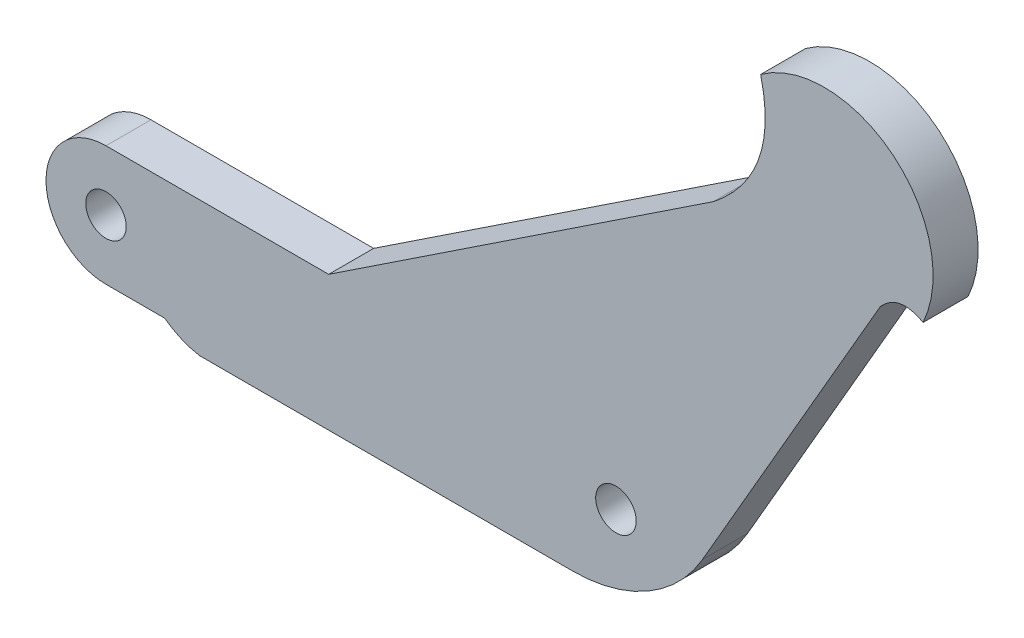
ISO-10303-21;
HEADER;
FILE_DESCRIPTION(('STEP AP214'),'2;1');
FILE_NAME('part.step','',(''),(''),'','','');
FILE_SCHEMA(('AUTOMOTIVE_DESIGN { 1 0 10303 214 1 1 1 1 }'));
ENDSEC;
DATA;
#1=APPLICATION_CONTEXT('core data for automotive mechanical design processes');
#2=APPLICATION_PROTOCOL_DEFINITION('international standard','automotive_design',2000,#1);
#3=PRODUCT_CONTEXT('',#1,'mechanical');
#4=PRODUCT('Part','Part','',(#3));
#5=PRODUCT_RELATED_PRODUCT_CATEGORY('part','',(#4));
#6=PRODUCT_DEFINITION_FORMATION('','',#4);
#7=PRODUCT_DEFINITION_CONTEXT('part definition',#1,'design');
#8=PRODUCT_DEFINITION('design','',#6,#7);
#9=PRODUCT_DEFINITION_SHAPE('','',#8);
#10=(LENGTH_UNIT() NAMED_UNIT(*) SI_UNIT(.MILLI.,.METRE.));
#11=(NAMED_UNIT(*) PLANE_ANGLE_UNIT() SI_UNIT($,.RADIAN.));
#12=(NAMED_UNIT(*) SI_UNIT($,.STERADIAN.) SOLID_ANGLE_UNIT());
#13=UNCERTAINTY_MEASURE_WITH_UNIT(LENGTH_MEASURE(1.E-05),#10,'distance_accuracy_value','');
#14=(GEOMETRIC_REPRESENTATION_CONTEXT(3) GLOBAL_UNCERTAINTY_ASSIGNED_CONTEXT((#13)) GLOBAL_UNIT_ASSIGNED_CONTEXT((#10,
#11,#12)) REPRESENTATION_CONTEXT('',''));
#15=CARTESIAN_POINT('',(0.,0.,0.));
#16=DIRECTION('',(0.,0.,1.));
#17=DIRECTION('',(1.,0.,0.));
#18=AXIS2_PLACEMENT_3D('',#15,#16,#17);
#19=CARTESIAN_POINT('',(5.00791760518448,-4.63372021491549,3.));
#20=DIRECTION('',(0.,0.,-1.));
#21=DIRECTION('',(-1.,0.,0.));
#22=AXIS2_PLACEMENT_3D('',#19,#20,#21);
#23=PLANE('',#22);
#24=CARTESIAN_POINT('',(3.90834377715203,-4.,3.));
#25=CARTESIAN_POINT('',(4.94861431033888,-4.76744042983098,3.));
#26=CARTESIAN_POINT('',(6.22609802290814,-4.99999999999998,3.));
#27=B_SPLINE_CURVE_WITH_KNOTS('',2,(#24,#25,#26),.UNSPECIFIED.,.F.,.F.,(3,3),(0.,1.),.UNSPECIFIED.);
#28=CARTESIAN_POINT('',(3.90834377715203,-4.,3.));
#29=VERTEX_POINT('',#28);
#30=CARTESIAN_POINT('',(6.22609802290814,-5.,3.));
#31=VERTEX_POINT('',#30);
#32=EDGE_CURVE('E189',#29,#31,#27,.T.);
#33=ORIENTED_EDGE('',*,*,#32,.T.);
#34=DIRECTION('',(1.,0.,0.));
#35=VECTOR('',#34,1.);
#36=CARTESIAN_POINT('',(6.22609802290814,-5.,3.));
#37=LINE('',#36,#35);
#38=CARTESIAN_POINT('',(31.1132486540519,-4.99999999999999,3.));
#39=VERTEX_POINT('',#38);
#40=EDGE_CURVE('E107',#31,#39,#37,.T.);
#41=ORIENTED_EDGE('',*,*,#40,.T.);
#42=CARTESIAN_POINT('',(31.1132486540519,5.,3.));
#43=DIRECTION('',(0.,0.,1.));
#44=DIRECTION('',(-1.,0.,0.));
#45=AXIS2_PLACEMENT_3D('',#42,#43,#44);
#46=CIRCLE('',#45,9.99999999999999);
#47=CARTESIAN_POINT('',(39.7735026918963,0.,3.));
#48=VERTEX_POINT('',#47);
#49=EDGE_CURVE('E213',#39,#48,#46,.T.);
#50=ORIENTED_EDGE('',*,*,#49,.T.);
#51=DIRECTION('',(0.499999999999997,0.86602540378444,0.));
#52=VECTOR('',#51,1.);
#53=CARTESIAN_POINT('',(39.7735026918963,0.,3.));
#54=LINE('',#53,#52);
#55=CARTESIAN_POINT('',(51.6228835506288,20.5237296855591,3.));
#56=VERTEX_POINT('',#55);
#57=EDGE_CURVE('E232',#48,#56,#54,.T.);
#58=ORIENTED_EDGE('',*,*,#57,.T.);
#59=CARTESIAN_POINT('',(51.6228835506288,20.5237296855591,3.));
#60=CARTESIAN_POINT('',(52.8721755195329,21.9254029836032,3.));
#61=CARTESIAN_POINT('',(54.4751915113158,21.0327278742431,3.));
#62=B_SPLINE_CURVE_WITH_KNOTS('',2,(#59,#60,#61),.UNSPECIFIED.,.F.,.F.,(3,3),(0.,1.),.UNSPECIFIED.);
#63=CARTESIAN_POINT('',(54.4751915113158,21.0327278742431,3.));
#64=VERTEX_POINT('',#63);
#65=EDGE_CURVE('E229',#56,#64,#62,.T.);
#66=ORIENTED_EDGE('',*,*,#65,.T.);
#67=CARTESIAN_POINT('',(47.9017878531486,24.0786028776974,3.));
#68=DIRECTION('',(0.,0.,1.));
#69=DIRECTION('',(-1.,0.,0.));
#70=AXIS2_PLACEMENT_3D('',#67,#68,#69);
#71=CIRCLE('',#70,7.24479055527993);
#72=CARTESIAN_POINT('',(43.647343513306,29.9426197218968,3.));
#73=VERTEX_POINT('',#72);
#74=EDGE_CURVE('E231',#64,#73,#71,.T.);
#75=ORIENTED_EDGE('',*,*,#74,.T.);
#76=CARTESIAN_POINT('',(43.647343513306,29.9426197218968,3.));
#77=CARTESIAN_POINT('',(44.9825272231688,24.5269264753896,3.));
#78=CARTESIAN_POINT('',(40.471851368007,21.0058778462506,3.));
#79=B_SPLINE_CURVE_WITH_KNOTS('',2,(#76,#77,#78),.UNSPECIFIED.,.F.,.F.,(3,3),(0.,1.),.UNSPECIFIED.);
#80=CARTESIAN_POINT('',(40.471851368007,21.0058778462506,3.));
#81=VERTEX_POINT('',#80);
#82=EDGE_CURVE('E234',#73,#81,#79,.T.);
#83=ORIENTED_EDGE('',*,*,#82,.T.);
#84=DIRECTION('',(-0.833210160779181,-0.552956443107711,0.));
#85=VECTOR('',#84,1.);
#86=CARTESIAN_POINT('',(14.8469212472353,4.,3.));
#87=LINE('',#86,#85);
#88=CARTESIAN_POINT('',(14.8469212472353,4.,3.));
#89=VERTEX_POINT('',#88);
#90=EDGE_CURVE('E135',#81,#89,#87,.T.);
#91=ORIENTED_EDGE('',*,*,#90,.T.);
#92=DIRECTION('',(-1.,0.,0.));
#93=VECTOR('',#92,1.);
#94=CARTESIAN_POINT('',(0.,4.,3.));
#95=LINE('',#94,#93);
#96=CARTESIAN_POINT('',(0.,4.,3.));
#97=VERTEX_POINT('',#96);
#98=EDGE_CURVE('E129',#89,#97,#95,.T.);
#99=ORIENTED_EDGE('',*,*,#98,.T.);
#100=CARTESIAN_POINT('',(0.,0.,3.));
#101=DIRECTION('',(0.,0.,1.));
#102=DIRECTION('',(1.,0.,0.));
#103=AXIS2_PLACEMENT_3D('',#100,#101,#102);
#104=CIRCLE('',#103,4.);
#105=CARTESIAN_POINT('',(0.,-4.,3.));
#106=VERTEX_POINT('',#105);
#107=EDGE_CURVE('E133',#97,#106,#104,.T.);
#108=ORIENTED_EDGE('',*,*,#107,.T.);
#109=DIRECTION('',(1.,0.,0.));
#110=VECTOR('',#109,1.);
#111=CARTESIAN_POINT('',(0.,-4.,3.));
#112=LINE('',#111,#110);
#113=EDGE_CURVE('E55',#106,#29,#112,.T.);
#114=ORIENTED_EDGE('',*,*,#113,.T.);
#115=EDGE_LOOP('',(#33,#41,#50,#58,#66,#75,#83,#91,#99,#108,#114));
#116=FACE_BOUND('',#115,.T.);
#117=CARTESIAN_POINT('',(0.,0.,3.));
#118=DIRECTION('',(0.,0.,1.));
#119=DIRECTION('',(1.,0.,0.));
#120=AXIS2_PLACEMENT_3D('',#117,#118,#119);
#121=CIRCLE('',#120,1.35);
#122=CARTESIAN_POINT('',(1.35,0.,3.));
#123=VERTEX_POINT('',#122);
#124=EDGE_CURVE('E159',#123,#123,#121,.T.);
#125=ORIENTED_EDGE('',*,*,#124,.F.);
#126=EDGE_LOOP('',(#125));
#127=FACE_BOUND('',#126,.T.);
#128=CARTESIAN_POINT('',(34.,0.,3.));
#129=DIRECTION('',(0.,0.,1.));
#130=DIRECTION('',(1.,0.,0.));
#131=AXIS2_PLACEMENT_3D('',#128,#129,#130);
#132=CIRCLE('',#131,1.35);
#133=CARTESIAN_POINT('',(35.35,0.,3.));
#134=VERTEX_POINT('',#133);
#135=EDGE_CURVE('E308',#134,#134,#132,.T.);
#136=ORIENTED_EDGE('',*,*,#135,.F.);
#137=EDGE_LOOP('',(#136));
#138=FACE_BOUND('',#137,.T.);
#139=ADVANCED_FACE('F37',(#116,#127,#138),#23,.F.);
#140=CARTESIAN_POINT('',(5.00791760518448,-4.63372021491549,0.));
#141=DIRECTION('',(0.,0.,-1.));
#142=DIRECTION('',(-1.,0.,0.));
#143=AXIS2_PLACEMENT_3D('',#140,#141,#142);
#144=PLANE('',#143);
#145=CARTESIAN_POINT('',(0.,0.,0.));
#146=DIRECTION('',(0.,0.,1.));
#147=DIRECTION('',(1.,0.,0.));
#148=AXIS2_PLACEMENT_3D('',#145,#146,#147);
#149=CIRCLE('',#148,1.35);
#150=CARTESIAN_POINT('',(1.35,0.,0.));
#151=VERTEX_POINT('',#150);
#152=EDGE_CURVE('E302',#151,#151,#149,.T.);
#153=ORIENTED_EDGE('',*,*,#152,.T.);
#154=EDGE_LOOP('',(#153));
#155=FACE_BOUND('',#154,.T.);
#156=CARTESIAN_POINT('',(3.90834377715203,-4.,0.));
#157=CARTESIAN_POINT('',(4.94861431033888,-4.76744042983098,0.));
#158=CARTESIAN_POINT('',(6.22609802290814,-4.99999999999998,0.));
#159=B_SPLINE_CURVE_WITH_KNOTS('',2,(#156,#157,#158),.UNSPECIFIED.,.F.,.F.,(3,3),(0.,1.),.UNSPECIFIED.);
#160=CARTESIAN_POINT('',(3.90834377715203,-4.,0.));
#161=VERTEX_POINT('',#160);
#162=CARTESIAN_POINT('',(6.22609802290814,-5.,0.));
#163=VERTEX_POINT('',#162);
#164=EDGE_CURVE('E153',#161,#163,#159,.T.);
#165=ORIENTED_EDGE('',*,*,#164,.F.);
#166=DIRECTION('',(1.,0.,0.));
#167=VECTOR('',#166,1.);
#168=CARTESIAN_POINT('',(0.,-4.,0.));
#169=LINE('',#168,#167);
#170=CARTESIAN_POINT('',(0.,-4.,0.));
#171=VERTEX_POINT('',#170);
#172=EDGE_CURVE('E99',#171,#161,#169,.T.);
#173=ORIENTED_EDGE('',*,*,#172,.F.);
#174=CARTESIAN_POINT('',(0.,0.,0.));
#175=DIRECTION('',(0.,0.,1.));
#176=DIRECTION('',(1.,0.,0.));
#177=AXIS2_PLACEMENT_3D('',#174,#175,#176);
#178=CIRCLE('',#177,4.);
#179=CARTESIAN_POINT('',(0.,4.,0.));
#180=VERTEX_POINT('',#179);
#181=EDGE_CURVE('E93',#180,#171,#178,.T.);
#182=ORIENTED_EDGE('',*,*,#181,.F.);
#183=DIRECTION('',(-1.,0.,0.));
#184=VECTOR('',#183,1.);
#185=CARTESIAN_POINT('',(0.,4.,0.));
#186=LINE('',#185,#184);
#187=CARTESIAN_POINT('',(14.8469212472353,4.,0.));
#188=VERTEX_POINT('',#187);
#189=EDGE_CURVE('E143',#188,#180,#186,.T.);
#190=ORIENTED_EDGE('',*,*,#189,.F.);
#191=DIRECTION('',(-0.833210160779181,-0.552956443107711,0.));
#192=VECTOR('',#191,1.);
#193=CARTESIAN_POINT('',(14.8469212472353,4.,0.));
#194=LINE('',#193,#192);
#195=CARTESIAN_POINT('',(40.471851368007,21.0058778462506,0.));
#196=VERTEX_POINT('',#195);
#197=EDGE_CURVE('E181',#196,#188,#194,.T.);
#198=ORIENTED_EDGE('',*,*,#197,.F.);
#199=CARTESIAN_POINT('',(43.647343513306,29.9426197218968,0.));
#200=CARTESIAN_POINT('',(44.9825272231688,24.5269264753896,0.));
#201=CARTESIAN_POINT('',(40.471851368007,21.0058778462506,0.));
#202=B_SPLINE_CURVE_WITH_KNOTS('',2,(#199,#200,#201),.UNSPECIFIED.,.F.,.F.,(3,3),(0.,1.),.UNSPECIFIED.);
#203=CARTESIAN_POINT('',(43.647343513306,29.9426197218968,0.));
#204=VERTEX_POINT('',#203);
#205=EDGE_CURVE('E177',#204,#196,#202,.T.);
#206=ORIENTED_EDGE('',*,*,#205,.F.);
#207=CARTESIAN_POINT('',(47.9017878531486,24.0786028776974,0.));
#208=DIRECTION('',(0.,0.,1.));
#209=DIRECTION('',(-1.,0.,0.));
#210=AXIS2_PLACEMENT_3D('',#207,#208,#209);
#211=CIRCLE('',#210,7.24479055527993);
#212=CARTESIAN_POINT('',(54.4751915113158,21.0327278742431,0.));
#213=VERTEX_POINT('',#212);
#214=EDGE_CURVE('E172',#213,#204,#211,.T.);
#215=ORIENTED_EDGE('',*,*,#214,.F.);
#216=CARTESIAN_POINT('',(51.6228835506288,20.5237296855591,0.));
#217=CARTESIAN_POINT('',(52.8721755195329,21.9254029836032,0.));
#218=CARTESIAN_POINT('',(54.4751915113158,21.0327278742431,0.));
#219=B_SPLINE_CURVE_WITH_KNOTS('',2,(#216,#217,#218),.UNSPECIFIED.,.F.,.F.,(3,3),(0.,1.),.UNSPECIFIED.);
#220=CARTESIAN_POINT('',(51.6228835506288,20.5237296855591,0.));
#221=VERTEX_POINT('',#220);
#222=EDGE_CURVE('E168',#221,#213,#219,.T.);
#223=ORIENTED_EDGE('',*,*,#222,.F.);
#224=DIRECTION('',(0.499999999999997,0.86602540378444,0.));
#225=VECTOR('',#224,1.);
#226=CARTESIAN_POINT('',(39.7735026918963,0.,0.));
#227=LINE('',#226,#225);
#228=CARTESIAN_POINT('',(39.7735026918963,0.,0.));
#229=VERTEX_POINT('',#228);
#230=EDGE_CURVE('E166',#229,#221,#227,.T.);
#231=ORIENTED_EDGE('',*,*,#230,.F.);
#232=CARTESIAN_POINT('',(31.1132486540519,5.,0.));
#233=DIRECTION('',(0.,0.,1.));
#234=DIRECTION('',(-1.,0.,0.));
#235=AXIS2_PLACEMENT_3D('',#232,#233,#234);
#236=CIRCLE('',#235,9.99999999999999);
#237=CARTESIAN_POINT('',(31.1132486540519,-4.99999999999999,0.));
#238=VERTEX_POINT('',#237);
#239=EDGE_CURVE('E164',#238,#229,#236,.T.);
#240=ORIENTED_EDGE('',*,*,#239,.F.);
#241=DIRECTION('',(1.,0.,0.));
#242=VECTOR('',#241,1.);
#243=CARTESIAN_POINT('',(6.22609802290814,-5.,0.));
#244=LINE('',#243,#242);
#245=EDGE_CURVE('E158',#163,#238,#244,.T.);
#246=ORIENTED_EDGE('',*,*,#245,.F.);
#247=EDGE_LOOP('',(#165,#173,#182,#190,#198,#206,#215,#223,#231,#240,#246));
#248=FACE_BOUND('',#247,.T.);
#249=CARTESIAN_POINT('',(34.,0.,0.));
#250=DIRECTION('',(0.,0.,1.));
#251=DIRECTION('',(1.,0.,0.));
#252=AXIS2_PLACEMENT_3D('',#249,#250,#251);
#253=CIRCLE('',#252,1.35);
#254=CARTESIAN_POINT('',(35.35,0.,0.));
#255=VERTEX_POINT('',#254);
#256=EDGE_CURVE('E311',#255,#255,#253,.T.);
#257=ORIENTED_EDGE('',*,*,#256,.T.);
#258=EDGE_LOOP('',(#257));
#259=FACE_BOUND('',#258,.T.);
#260=ADVANCED_FACE('F217',(#155,#248,#259),#144,.T.);
#261=DIRECTION('',(0.,0.,-1.));
#262=VECTOR('',#261,1.);
#263=SURFACE_OF_LINEAR_EXTRUSION('',#27,#262);
#264=ORIENTED_EDGE('',*,*,#164,.T.);
#265=DIRECTION('',(0.,0.,-1.));
#266=VECTOR('',#265,1.);
#267=CARTESIAN_POINT('',(6.22609802290814,-5.,3.));
#268=LINE('',#267,#266);
#269=EDGE_CURVE('E11',#31,#163,#268,.T.);
#270=ORIENTED_EDGE('',*,*,#269,.F.);
#271=ORIENTED_EDGE('',*,*,#32,.F.);
#272=DIRECTION('',(0.,0.,-1.));
#273=VECTOR('',#272,1.);
#274=CARTESIAN_POINT('',(3.90834377715203,-4.,3.));
#275=LINE('',#274,#273);
#276=EDGE_CURVE('E149',#29,#161,#275,.T.);
#277=ORIENTED_EDGE('',*,*,#276,.T.);
#278=EDGE_LOOP('',(#264,#270,#271,#277));
#279=FACE_BOUND('',#278,.T.);
#280=ADVANCED_FACE('F39',(#279),#263,.F.);
#281=CARTESIAN_POINT('',(6.22609802290814,-5.,3.));
#282=DIRECTION('',(0.,1.,0.));
#283=DIRECTION('',(-1.,0.,0.));
#284=AXIS2_PLACEMENT_3D('',#281,#282,#283);
#285=PLANE('',#284);
#286=ORIENTED_EDGE('',*,*,#245,.T.);
#287=DIRECTION('',(0.,0.,-1.));
#288=VECTOR('',#287,1.);
#289=CARTESIAN_POINT('',(31.1132486540519,-4.99999999999999,3.));
#290=LINE('',#289,#288);
#291=EDGE_CURVE('E47',#39,#238,#290,.T.);
#292=ORIENTED_EDGE('',*,*,#291,.F.);
#293=ORIENTED_EDGE('',*,*,#40,.F.);
#294=ORIENTED_EDGE('',*,*,#269,.T.);
#295=EDGE_LOOP('',(#286,#292,#293,#294));
#296=FACE_BOUND('',#295,.T.);
#297=ADVANCED_FACE('F254',(#296),#285,.F.);
#298=CARTESIAN_POINT('',(31.1132486540519,5.,3.));
#299=DIRECTION('',(0.,0.,-1.));
#300=DIRECTION('',(-1.,0.,0.));
#301=AXIS2_PLACEMENT_3D('',#298,#299,#300);
#302=CYLINDRICAL_SURFACE('',#301,9.99999999999999);
#303=ORIENTED_EDGE('',*,*,#239,.T.);
#304=DIRECTION('',(0.,0.,-1.));
#305=VECTOR('',#304,1.);
#306=CARTESIAN_POINT('',(39.7735026918963,0.,3.));
#307=LINE('',#306,#305);
#308=EDGE_CURVE('E205',#48,#229,#307,.T.);
#309=ORIENTED_EDGE('',*,*,#308,.F.);
#310=ORIENTED_EDGE('',*,*,#49,.F.);
#311=ORIENTED_EDGE('',*,*,#291,.T.);
#312=EDGE_LOOP('',(#303,#309,#310,#311));
#313=FACE_BOUND('',#312,.T.);
#314=ADVANCED_FACE('F211',(#313),#302,.T.);
#315=CARTESIAN_POINT('',(39.7735026918963,0.,3.));
#316=DIRECTION('',(-0.86602540378444,0.499999999999997,0.));
#317=DIRECTION('',(-0.499999999999997,-0.86602540378444,0.));
#318=AXIS2_PLACEMENT_3D('',#315,#316,#317);
#319=PLANE('',#318);
#320=ORIENTED_EDGE('',*,*,#230,.T.);
#321=DIRECTION('',(0.,0.,-1.));
#322=VECTOR('',#321,1.);
#323=CARTESIAN_POINT('',(51.6228835506288,20.5237296855591,3.));
#324=LINE('',#323,#322);
#325=EDGE_CURVE('E202',#56,#221,#324,.T.);
#326=ORIENTED_EDGE('',*,*,#325,.F.);
#327=ORIENTED_EDGE('',*,*,#57,.F.);
#328=ORIENTED_EDGE('',*,*,#308,.T.);
#329=EDGE_LOOP('',(#320,#326,#327,#328));
#330=FACE_BOUND('',#329,.T.);
#331=ADVANCED_FACE('F223',(#330),#319,.F.);
#332=DIRECTION('',(0.,0.,-1.));
#333=VECTOR('',#332,1.);
#334=SURFACE_OF_LINEAR_EXTRUSION('',#62,#333);
#335=ORIENTED_EDGE('',*,*,#222,.T.);
#336=DIRECTION('',(0.,0.,-1.));
#337=VECTOR('',#336,1.);
#338=CARTESIAN_POINT('',(54.4751915113158,21.0327278742431,3.));
#339=LINE('',#338,#337);
#340=EDGE_CURVE('E199',#64,#213,#339,.T.);
#341=ORIENTED_EDGE('',*,*,#340,.F.);
#342=ORIENTED_EDGE('',*,*,#65,.F.);
#343=ORIENTED_EDGE('',*,*,#325,.T.);
#344=EDGE_LOOP('',(#335,#341,#342,#343));
#345=FACE_BOUND('',#344,.T.);
#346=ADVANCED_FACE('F227',(#345),#334,.F.);
#347=CARTESIAN_POINT('',(47.9017878531486,24.0786028776974,3.));
#348=DIRECTION('',(0.,0.,-1.));
#349=DIRECTION('',(-1.,0.,0.));
#350=AXIS2_PLACEMENT_3D('',#347,#348,#349);
#351=CYLINDRICAL_SURFACE('',#350,7.24479055527993);
#352=ORIENTED_EDGE('',*,*,#214,.T.);
#353=DIRECTION('',(0.,0.,-1.));
#354=VECTOR('',#353,1.);
#355=CARTESIAN_POINT('',(43.647343513306,29.9426197218968,3.));
#356=LINE('',#355,#354);
#357=EDGE_CURVE('E196',#73,#204,#356,.T.);
#358=ORIENTED_EDGE('',*,*,#357,.F.);
#359=ORIENTED_EDGE('',*,*,#74,.F.);
#360=ORIENTED_EDGE('',*,*,#340,.T.);
#361=EDGE_LOOP('',(#352,#358,#359,#360));
#362=FACE_BOUND('',#361,.T.);
#363=ADVANCED_FACE('F249',(#362),#351,.T.);
#364=DIRECTION('',(0.,0.,-1.));
#365=VECTOR('',#364,1.);
#366=SURFACE_OF_LINEAR_EXTRUSION('',#79,#365);
#367=ORIENTED_EDGE('',*,*,#205,.T.);
#368=DIRECTION('',(0.,0.,-1.));
#369=VECTOR('',#368,1.);
#370=CARTESIAN_POINT('',(40.471851368007,21.0058778462506,3.));
#371=LINE('',#370,#369);
#372=EDGE_CURVE('E193',#81,#196,#371,.T.);
#373=ORIENTED_EDGE('',*,*,#372,.F.);
#374=ORIENTED_EDGE('',*,*,#82,.F.);
#375=ORIENTED_EDGE('',*,*,#357,.T.);
#376=EDGE_LOOP('',(#367,#373,#374,#375));
#377=FACE_BOUND('',#376,.T.);
#378=ADVANCED_FACE('F280',(#377),#366,.F.);
#379=CARTESIAN_POINT('',(14.8469212472353,4.,3.));
#380=DIRECTION('',(0.552956443107711,-0.833210160779181,0.));
#381=DIRECTION('',(0.833210160779181,0.552956443107711,0.));
#382=AXIS2_PLACEMENT_3D('',#379,#380,#381);
#383=PLANE('',#382);
#384=ORIENTED_EDGE('',*,*,#197,.T.);
#385=DIRECTION('',(0.,0.,-1.));
#386=VECTOR('',#385,1.);
#387=CARTESIAN_POINT('',(14.8469212472353,4.,3.));
#388=LINE('',#387,#386);
#389=EDGE_CURVE('E144',#89,#188,#388,.T.);
#390=ORIENTED_EDGE('',*,*,#389,.F.);
#391=ORIENTED_EDGE('',*,*,#90,.F.);
#392=ORIENTED_EDGE('',*,*,#372,.T.);
#393=EDGE_LOOP('',(#384,#390,#391,#392));
#394=FACE_BOUND('',#393,.T.);
#395=ADVANCED_FACE('F278',(#394),#383,.F.);
#396=CARTESIAN_POINT('',(0.,4.,3.));
#397=DIRECTION('',(0.,-1.,0.));
#398=DIRECTION('',(0.,0.,-1.));
#399=AXIS2_PLACEMENT_3D('',#396,#397,#398);
#400=PLANE('',#399);
#401=ORIENTED_EDGE('',*,*,#189,.T.);
#402=DIRECTION('',(0.,0.,-1.));
#403=VECTOR('',#402,1.);
#404=CARTESIAN_POINT('',(0.,4.,3.));
#405=LINE('',#404,#403);
#406=EDGE_CURVE('E140',#97,#180,#405,.T.);
#407=ORIENTED_EDGE('',*,*,#406,.F.);
#408=ORIENTED_EDGE('',*,*,#98,.F.);
#409=ORIENTED_EDGE('',*,*,#389,.T.);
#410=EDGE_LOOP('',(#401,#407,#408,#409));
#411=FACE_BOUND('',#410,.T.);
#412=ADVANCED_FACE('F141',(#411),#400,.F.);
#413=CARTESIAN_POINT('',(0.,0.,3.));
#414=DIRECTION('',(0.,0.,-1.));
#415=DIRECTION('',(-1.,0.,0.));
#416=AXIS2_PLACEMENT_3D('',#413,#414,#415);
#417=CYLINDRICAL_SURFACE('',#416,4.);
#418=ORIENTED_EDGE('',*,*,#181,.T.);
#419=DIRECTION('',(0.,0.,-1.));
#420=VECTOR('',#419,1.);
#421=CARTESIAN_POINT('',(0.,-4.,3.));
#422=LINE('',#421,#420);
#423=EDGE_CURVE('E145',#106,#171,#422,.T.);
#424=ORIENTED_EDGE('',*,*,#423,.F.);
#425=ORIENTED_EDGE('',*,*,#107,.F.);
#426=ORIENTED_EDGE('',*,*,#406,.T.);
#427=EDGE_LOOP('',(#418,#424,#425,#426));
#428=FACE_BOUND('',#427,.T.);
#429=ADVANCED_FACE('F147',(#428),#417,.T.);
#430=CARTESIAN_POINT('',(0.,-4.,3.));
#431=DIRECTION('',(0.,1.,0.));
#432=DIRECTION('',(0.,0.,1.));
#433=AXIS2_PLACEMENT_3D('',#430,#431,#432);
#434=PLANE('',#433);
#435=ORIENTED_EDGE('',*,*,#172,.T.);
#436=ORIENTED_EDGE('',*,*,#276,.F.);
#437=ORIENTED_EDGE('',*,*,#113,.F.);
#438=ORIENTED_EDGE('',*,*,#423,.T.);
#439=EDGE_LOOP('',(#435,#436,#437,#438));
#440=FACE_BOUND('',#439,.T.);
#441=ADVANCED_FACE('F271',(#440),#434,.F.);
#442=CARTESIAN_POINT('',(0.,0.,3.));
#443=DIRECTION('',(0.,0.,-1.));
#444=DIRECTION('',(-1.,0.,0.));
#445=AXIS2_PLACEMENT_3D('',#442,#443,#444);
#446=CYLINDRICAL_SURFACE('',#445,1.35);
#447=ORIENTED_EDGE('',*,*,#124,.T.);
#448=EDGE_LOOP('',(#447));
#449=FACE_BOUND('',#448,.T.);
#450=ORIENTED_EDGE('',*,*,#152,.F.);
#451=EDGE_LOOP('',(#450));
#452=FACE_BOUND('',#451,.T.);
#453=ADVANCED_FACE('F268',(#449,#452),#446,.F.);
#454=CARTESIAN_POINT('',(34.,0.,3.));
#455=DIRECTION('',(0.,0.,-1.));
#456=DIRECTION('',(-1.,0.,0.));
#457=AXIS2_PLACEMENT_3D('',#454,#455,#456);
#458=CYLINDRICAL_SURFACE('',#457,1.35);
#459=ORIENTED_EDGE('',*,*,#135,.T.);
#460=EDGE_LOOP('',(#459));
#461=FACE_BOUND('',#460,.T.);
#462=ORIENTED_EDGE('',*,*,#256,.F.);
#463=EDGE_LOOP('',(#462));
#464=FACE_BOUND('',#463,.T.);
#465=ADVANCED_FACE('F317',(#461,#464),#458,.F.);
#466=CLOSED_SHELL('',(#139,#260,#280,#297,#314,#331,#346,#363,#378,#395,#412,#429,#441,#453,#465));
#467=MANIFOLD_SOLID_BREP('B2',#466);
#468=ADVANCED_BREP_SHAPE_REPRESENTATION('',(#18,#467),#14);
#469=SHAPE_DEFINITION_REPRESENTATION(#9,#468);
ENDSEC;
END-ISO-10303-21;
